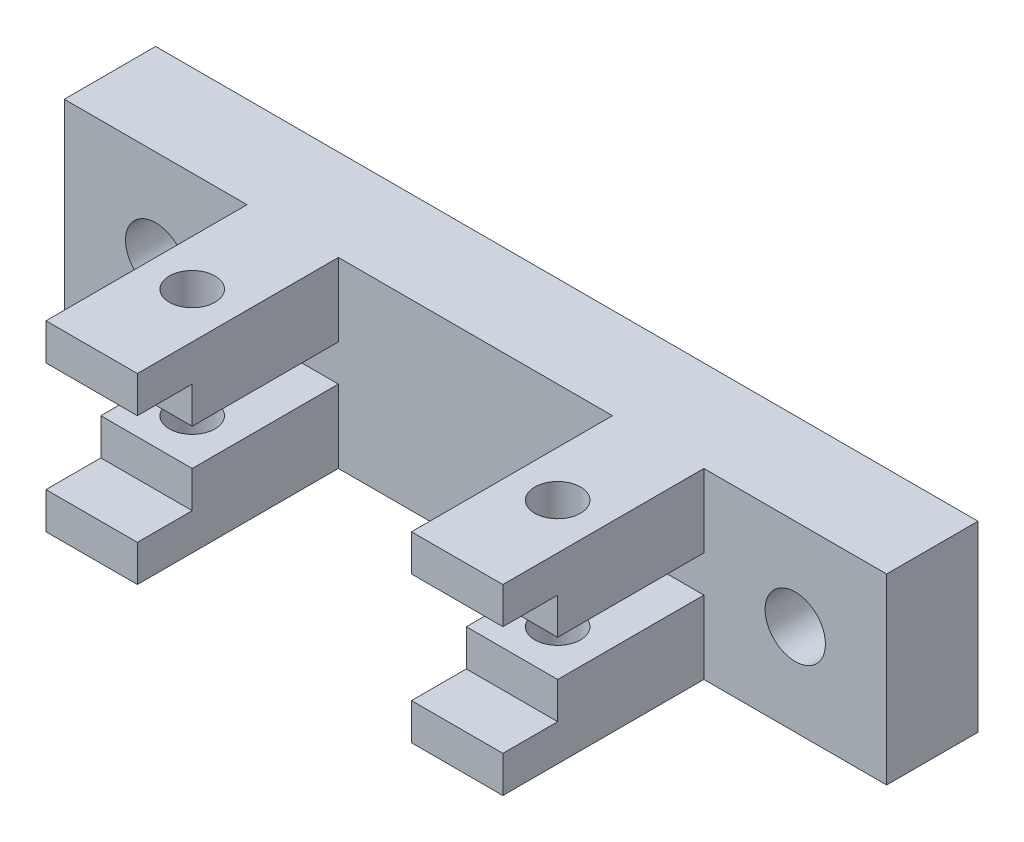
ISO-10303-21;
HEADER;
FILE_DESCRIPTION(('STEP AP214'),'2;1');
FILE_NAME('part.step','',(''),(''),'','','');
FILE_SCHEMA(('AUTOMOTIVE_DESIGN { 1 0 10303 214 1 1 1 1 }'));
ENDSEC;
DATA;
#1=APPLICATION_CONTEXT('core data for automotive mechanical design processes');
#2=APPLICATION_PROTOCOL_DEFINITION('international standard','automotive_design',2000,#1);
#3=PRODUCT_CONTEXT('',#1,'mechanical');
#4=PRODUCT('Part','Part','',(#3));
#5=PRODUCT_RELATED_PRODUCT_CATEGORY('part','',(#4));
#6=PRODUCT_DEFINITION_FORMATION('','',#4);
#7=PRODUCT_DEFINITION_CONTEXT('part definition',#1,'design');
#8=PRODUCT_DEFINITION('design','',#6,#7);
#9=PRODUCT_DEFINITION_SHAPE('','',#8);
#10=(LENGTH_UNIT() NAMED_UNIT(*) SI_UNIT(.MILLI.,.METRE.));
#11=(NAMED_UNIT(*) PLANE_ANGLE_UNIT() SI_UNIT($,.RADIAN.));
#12=(NAMED_UNIT(*) SI_UNIT($,.STERADIAN.) SOLID_ANGLE_UNIT());
#13=UNCERTAINTY_MEASURE_WITH_UNIT(LENGTH_MEASURE(1.E-05),#10,'distance_accuracy_value','');
#14=(GEOMETRIC_REPRESENTATION_CONTEXT(3) GLOBAL_UNCERTAINTY_ASSIGNED_CONTEXT((#13)) GLOBAL_UNIT_ASSIGNED_CONTEXT((#10,
#11,#12)) REPRESENTATION_CONTEXT('',''));
#15=CARTESIAN_POINT('',(0.,0.,0.));
#16=DIRECTION('',(0.,0.,1.));
#17=DIRECTION('',(1.,0.,0.));
#18=AXIS2_PLACEMENT_3D('',#15,#16,#17);
#19=CARTESIAN_POINT('',(7.5,-1.,16.));
#20=DIRECTION('',(0.,-1.,0.));
#21=DIRECTION('',(0.,0.,-1.));
#22=AXIS2_PLACEMENT_3D('',#19,#20,#21);
#23=PLANE('',#22);
#24=CARTESIAN_POINT('',(10.,-1.,10.5));
#25=DIRECTION('',(0.,-1.,0.));
#26=DIRECTION('',(0.,0.,-1.));
#27=AXIS2_PLACEMENT_3D('',#24,#25,#26);
#28=CIRCLE('',#27,1.25);
#29=CARTESIAN_POINT('',(10.,-1.,9.25));
#30=VERTEX_POINT('',#29);
#31=EDGE_CURVE('E509',#30,#30,#28,.T.);
#32=ORIENTED_EDGE('',*,*,#31,.T.);
#33=EDGE_LOOP('',(#32));
#34=FACE_BOUND('',#33,.T.);
#35=DIRECTION('',(-1.,0.,0.));
#36=VECTOR('',#35,1.);
#37=CARTESIAN_POINT('',(7.5,-1.,13.));
#38=LINE('',#37,#36);
#39=CARTESIAN_POINT('',(12.5,-1.,13.));
#40=VERTEX_POINT('',#39);
#41=CARTESIAN_POINT('',(7.5,-1.,13.));
#42=VERTEX_POINT('',#41);
#43=EDGE_CURVE('E231',#40,#42,#38,.T.);
#44=ORIENTED_EDGE('',*,*,#43,.F.);
#45=DIRECTION('',(0.,0.,-1.));
#46=VECTOR('',#45,1.);
#47=CARTESIAN_POINT('',(12.5,-1.,16.));
#48=LINE('',#47,#46);
#49=CARTESIAN_POINT('',(12.5,-1.,5.));
#50=VERTEX_POINT('',#49);
#51=EDGE_CURVE('E278',#40,#50,#48,.T.);
#52=ORIENTED_EDGE('',*,*,#51,.T.);
#53=DIRECTION('',(-1.,0.,0.));
#54=VECTOR('',#53,1.);
#55=CARTESIAN_POINT('',(7.5,-1.,5.));
#56=LINE('',#55,#54);
#57=CARTESIAN_POINT('',(7.5,-1.,5.));
#58=VERTEX_POINT('',#57);
#59=EDGE_CURVE('E264',#50,#58,#56,.T.);
#60=ORIENTED_EDGE('',*,*,#59,.T.);
#61=DIRECTION('',(0.,0.,-1.));
#62=VECTOR('',#61,1.);
#63=CARTESIAN_POINT('',(7.5,-1.,16.));
#64=LINE('',#63,#62);
#65=EDGE_CURVE('E269',#42,#58,#64,.T.);
#66=ORIENTED_EDGE('',*,*,#65,.F.);
#67=EDGE_LOOP('',(#44,#52,#60,#66));
#68=FACE_BOUND('',#67,.T.);
#69=ADVANCED_FACE('F32',(#34,#68),#23,.F.);
#70=CARTESIAN_POINT('',(-12.5,-1.,16.));
#71=DIRECTION('',(0.,-1.,0.));
#72=DIRECTION('',(0.,0.,-1.));
#73=AXIS2_PLACEMENT_3D('',#70,#71,#72);
#74=PLANE('',#73);
#75=CARTESIAN_POINT('',(-9.99999999999999,-1.,10.5));
#76=DIRECTION('',(0.,-1.,0.));
#77=DIRECTION('',(0.,0.,-1.));
#78=AXIS2_PLACEMENT_3D('',#75,#76,#77);
#79=CIRCLE('',#78,1.25);
#80=CARTESIAN_POINT('',(-9.99999999999999,-1.,9.25));
#81=VERTEX_POINT('',#80);
#82=EDGE_CURVE('E501',#81,#81,#79,.T.);
#83=ORIENTED_EDGE('',*,*,#82,.T.);
#84=EDGE_LOOP('',(#83));
#85=FACE_BOUND('',#84,.T.);
#86=DIRECTION('',(-1.,0.,0.));
#87=VECTOR('',#86,1.);
#88=CARTESIAN_POINT('',(-12.5,-1.,13.));
#89=LINE('',#88,#87);
#90=CARTESIAN_POINT('',(-7.5,-1.,13.));
#91=VERTEX_POINT('',#90);
#92=CARTESIAN_POINT('',(-12.5,-1.,13.));
#93=VERTEX_POINT('',#92);
#94=EDGE_CURVE('E254',#91,#93,#89,.T.);
#95=ORIENTED_EDGE('',*,*,#94,.F.);
#96=DIRECTION('',(0.,0.,-1.));
#97=VECTOR('',#96,1.);
#98=CARTESIAN_POINT('',(-7.5,-1.,16.));
#99=LINE('',#98,#97);
#100=CARTESIAN_POINT('',(-7.5,-1.,5.));
#101=VERTEX_POINT('',#100);
#102=EDGE_CURVE('E304',#91,#101,#99,.T.);
#103=ORIENTED_EDGE('',*,*,#102,.T.);
#104=DIRECTION('',(-1.,0.,0.));
#105=VECTOR('',#104,1.);
#106=CARTESIAN_POINT('',(-12.5,-1.,5.));
#107=LINE('',#106,#105);
#108=CARTESIAN_POINT('',(-12.5,-1.,5.));
#109=VERTEX_POINT('',#108);
#110=EDGE_CURVE('E290',#101,#109,#107,.T.);
#111=ORIENTED_EDGE('',*,*,#110,.T.);
#112=DIRECTION('',(0.,0.,-1.));
#113=VECTOR('',#112,1.);
#114=CARTESIAN_POINT('',(-12.5,-1.,16.));
#115=LINE('',#114,#113);
#116=EDGE_CURVE('E295',#93,#109,#115,.T.);
#117=ORIENTED_EDGE('',*,*,#116,.F.);
#118=EDGE_LOOP('',(#95,#103,#111,#117));
#119=FACE_BOUND('',#118,.T.);
#120=ADVANCED_FACE('F530',(#85,#119),#74,.F.);
#121=CARTESIAN_POINT('',(0.,0.,5.));
#122=DIRECTION('',(0.,0.,1.));
#123=DIRECTION('',(1.,0.,0.));
#124=AXIS2_PLACEMENT_3D('',#121,#122,#123);
#125=PLANE('',#124);
#126=CARTESIAN_POINT('',(17.5,0.,5.));
#127=DIRECTION('',(0.,0.,1.));
#128=DIRECTION('',(1.,0.,0.));
#129=AXIS2_PLACEMENT_3D('',#126,#127,#128);
#130=CIRCLE('',#129,1.65);
#131=CARTESIAN_POINT('',(19.15,0.,5.));
#132=VERTEX_POINT('',#131);
#133=EDGE_CURVE('E312',#132,#132,#130,.T.);
#134=ORIENTED_EDGE('',*,*,#133,.F.);
#135=EDGE_LOOP('',(#134));
#136=FACE_BOUND('',#135,.T.);
#137=CARTESIAN_POINT('',(-17.5,0.,5.));
#138=DIRECTION('',(0.,0.,1.));
#139=DIRECTION('',(1.,0.,0.));
#140=AXIS2_PLACEMENT_3D('',#137,#138,#139);
#141=CIRCLE('',#140,1.65);
#142=CARTESIAN_POINT('',(-15.85,0.,5.));
#143=VERTEX_POINT('',#142);
#144=EDGE_CURVE('E316',#143,#143,#141,.T.);
#145=ORIENTED_EDGE('',*,*,#144,.F.);
#146=EDGE_LOOP('',(#145));
#147=FACE_BOUND('',#146,.T.);
#148=DIRECTION('',(1.,0.,0.));
#149=VECTOR('',#148,1.);
#150=CARTESIAN_POINT('',(-22.5,-5.,5.));
#151=LINE('',#150,#149);
#152=CARTESIAN_POINT('',(-7.5,-5.,5.));
#153=VERTEX_POINT('',#152);
#154=CARTESIAN_POINT('',(7.5,-5.,5.));
#155=VERTEX_POINT('',#154);
#156=EDGE_CURVE('E448',#153,#155,#151,.T.);
#157=ORIENTED_EDGE('',*,*,#156,.T.);
#158=DIRECTION('',(0.,-1.,0.));
#159=VECTOR('',#158,1.);
#160=CARTESIAN_POINT('',(7.5,-5.,5.));
#161=LINE('',#160,#159);
#162=EDGE_CURVE('E260',#58,#155,#161,.T.);
#163=ORIENTED_EDGE('',*,*,#162,.F.);
#164=ORIENTED_EDGE('',*,*,#59,.F.);
#165=DIRECTION('',(0.,1.,0.));
#166=VECTOR('',#165,1.);
#167=CARTESIAN_POINT('',(12.5,-5.,5.));
#168=LINE('',#167,#166);
#169=CARTESIAN_POINT('',(12.5,-5.,5.));
#170=VERTEX_POINT('',#169);
#171=EDGE_CURVE('E272',#170,#50,#168,.T.);
#172=ORIENTED_EDGE('',*,*,#171,.F.);
#173=CARTESIAN_POINT('',(22.5,-5.,5.));
#174=VERTEX_POINT('',#173);
#175=EDGE_CURVE('E444',#170,#174,#151,.T.);
#176=ORIENTED_EDGE('',*,*,#175,.T.);
#177=DIRECTION('',(0.,1.,0.));
#178=VECTOR('',#177,1.);
#179=CARTESIAN_POINT('',(22.5,5.,5.));
#180=LINE('',#179,#178);
#181=CARTESIAN_POINT('',(22.5,5.,5.));
#182=VERTEX_POINT('',#181);
#183=EDGE_CURVE('E435',#174,#182,#180,.T.);
#184=ORIENTED_EDGE('',*,*,#183,.T.);
#185=DIRECTION('',(-1.,0.,0.));
#186=VECTOR('',#185,1.);
#187=CARTESIAN_POINT('',(-22.5,5.,5.));
#188=LINE('',#187,#186);
#189=CARTESIAN_POINT('',(12.5,5.,5.));
#190=VERTEX_POINT('',#189);
#191=EDGE_CURVE('E436',#182,#190,#188,.T.);
#192=ORIENTED_EDGE('',*,*,#191,.T.);
#193=DIRECTION('',(0.,1.,0.));
#194=VECTOR('',#193,1.);
#195=CARTESIAN_POINT('',(12.5,5.,5.));
#196=LINE('',#195,#194);
#197=CARTESIAN_POINT('',(12.5,0.999999999999999,5.));
#198=VERTEX_POINT('',#197);
#199=EDGE_CURVE('E373',#198,#190,#196,.T.);
#200=ORIENTED_EDGE('',*,*,#199,.F.);
#201=DIRECTION('',(1.,0.,0.));
#202=VECTOR('',#201,1.);
#203=CARTESIAN_POINT('',(7.5,0.999999999999999,5.));
#204=LINE('',#203,#202);
#205=CARTESIAN_POINT('',(7.5,0.999999999999999,5.));
#206=VERTEX_POINT('',#205);
#207=EDGE_CURVE('E380',#206,#198,#204,.T.);
#208=ORIENTED_EDGE('',*,*,#207,.F.);
#209=DIRECTION('',(0.,-1.,0.));
#210=VECTOR('',#209,1.);
#211=CARTESIAN_POINT('',(7.5,5.,5.));
#212=LINE('',#211,#210);
#213=CARTESIAN_POINT('',(7.5,5.,5.));
#214=VERTEX_POINT('',#213);
#215=EDGE_CURVE('E367',#214,#206,#212,.T.);
#216=ORIENTED_EDGE('',*,*,#215,.F.);
#217=CARTESIAN_POINT('',(-7.5,5.,5.));
#218=VERTEX_POINT('',#217);
#219=EDGE_CURVE('E36',#214,#218,#188,.T.);
#220=ORIENTED_EDGE('',*,*,#219,.T.);
#221=DIRECTION('',(0.,1.,0.));
#222=VECTOR('',#221,1.);
#223=CARTESIAN_POINT('',(-7.49999999999999,5.,5.));
#224=LINE('',#223,#222);
#225=CARTESIAN_POINT('',(-7.49999999999999,0.999999999999999,5.));
#226=VERTEX_POINT('',#225);
#227=EDGE_CURVE('E399',#226,#218,#224,.T.);
#228=ORIENTED_EDGE('',*,*,#227,.F.);
#229=DIRECTION('',(1.,0.,0.));
#230=VECTOR('',#229,1.);
#231=CARTESIAN_POINT('',(-12.5,0.999999999999999,5.));
#232=LINE('',#231,#230);
#233=CARTESIAN_POINT('',(-12.5,0.999999999999999,5.));
#234=VERTEX_POINT('',#233);
#235=EDGE_CURVE('E404',#234,#226,#232,.T.);
#236=ORIENTED_EDGE('',*,*,#235,.F.);
#237=DIRECTION('',(0.,-1.,0.));
#238=VECTOR('',#237,1.);
#239=CARTESIAN_POINT('',(-12.5,5.,5.));
#240=LINE('',#239,#238);
#241=CARTESIAN_POINT('',(-12.5,5.,5.));
#242=VERTEX_POINT('',#241);
#243=EDGE_CURVE('E394',#242,#234,#240,.T.);
#244=ORIENTED_EDGE('',*,*,#243,.F.);
#245=CARTESIAN_POINT('',(-22.5,5.,5.));
#246=VERTEX_POINT('',#245);
#247=EDGE_CURVE('E433',#242,#246,#188,.T.);
#248=ORIENTED_EDGE('',*,*,#247,.T.);
#249=DIRECTION('',(0.,-1.,0.));
#250=VECTOR('',#249,1.);
#251=CARTESIAN_POINT('',(-22.5,5.,5.));
#252=LINE('',#251,#250);
#253=CARTESIAN_POINT('',(-22.5,-5.,5.));
#254=VERTEX_POINT('',#253);
#255=EDGE_CURVE('E440',#246,#254,#252,.T.);
#256=ORIENTED_EDGE('',*,*,#255,.T.);
#257=CARTESIAN_POINT('',(-12.5,-5.,5.));
#258=VERTEX_POINT('',#257);
#259=EDGE_CURVE('E445',#254,#258,#151,.T.);
#260=ORIENTED_EDGE('',*,*,#259,.T.);
#261=DIRECTION('',(0.,-1.,0.));
#262=VECTOR('',#261,1.);
#263=CARTESIAN_POINT('',(-12.5,-5.,5.));
#264=LINE('',#263,#262);
#265=EDGE_CURVE('E286',#109,#258,#264,.T.);
#266=ORIENTED_EDGE('',*,*,#265,.F.);
#267=ORIENTED_EDGE('',*,*,#110,.F.);
#268=DIRECTION('',(0.,1.,0.));
#269=VECTOR('',#268,1.);
#270=CARTESIAN_POINT('',(-7.5,-5.,5.));
#271=LINE('',#270,#269);
#272=EDGE_CURVE('E298',#153,#101,#271,.T.);
#273=ORIENTED_EDGE('',*,*,#272,.F.);
#274=EDGE_LOOP('',(#157,#163,#164,#172,#176,#184,#192,#200,#208,#216,#220,#228,#236,#244,#248,
#256,#260,#266,#267,#273));
#275=FACE_BOUND('',#274,.T.);
#276=ADVANCED_FACE('F484',(#136,#147,#275),#125,.T.);
#277=CARTESIAN_POINT('',(7.5,0.999999999999999,16.));
#278=DIRECTION('',(0.,1.,0.));
#279=DIRECTION('',(-1.,0.,0.));
#280=AXIS2_PLACEMENT_3D('',#277,#278,#279);
#281=PLANE('',#280);
#282=CARTESIAN_POINT('',(10.,0.999999999999999,10.5));
#283=DIRECTION('',(0.,1.,0.));
#284=DIRECTION('',(-1.,0.,0.));
#285=AXIS2_PLACEMENT_3D('',#282,#283,#284);
#286=CIRCLE('',#285,1.25);
#287=CARTESIAN_POINT('',(8.75000000000001,0.999999999999999,10.5));
#288=VERTEX_POINT('',#287);
#289=EDGE_CURVE('E327',#288,#288,#286,.T.);
#290=ORIENTED_EDGE('',*,*,#289,.T.);
#291=EDGE_LOOP('',(#290));
#292=FACE_BOUND('',#291,.T.);
#293=DIRECTION('',(1.,0.,0.));
#294=VECTOR('',#293,1.);
#295=CARTESIAN_POINT('',(7.5,0.999999999999999,13.));
#296=LINE('',#295,#294);
#297=CARTESIAN_POINT('',(7.5,0.999999999999999,13.));
#298=VERTEX_POINT('',#297);
#299=CARTESIAN_POINT('',(12.5,0.999999999999999,13.));
#300=VERTEX_POINT('',#299);
#301=EDGE_CURVE('E339',#298,#300,#296,.T.);
#302=ORIENTED_EDGE('',*,*,#301,.F.);
#303=DIRECTION('',(0.,0.,-1.));
#304=VECTOR('',#303,1.);
#305=CARTESIAN_POINT('',(7.5,0.999999999999999,16.));
#306=LINE('',#305,#304);
#307=EDGE_CURVE('E392',#298,#206,#306,.T.);
#308=ORIENTED_EDGE('',*,*,#307,.T.);
#309=ORIENTED_EDGE('',*,*,#207,.T.);
#310=DIRECTION('',(0.,0.,-1.));
#311=VECTOR('',#310,1.);
#312=CARTESIAN_POINT('',(12.5,0.999999999999999,16.));
#313=LINE('',#312,#311);
#314=EDGE_CURVE('E390',#300,#198,#313,.T.);
#315=ORIENTED_EDGE('',*,*,#314,.F.);
#316=EDGE_LOOP('',(#302,#308,#309,#315));
#317=FACE_BOUND('',#316,.T.);
#318=ADVANCED_FACE('F645',(#292,#317),#281,.F.);
#319=CARTESIAN_POINT('',(-12.5,0.999999999999999,16.));
#320=DIRECTION('',(0.,1.,0.));
#321=DIRECTION('',(0.,0.,1.));
#322=AXIS2_PLACEMENT_3D('',#319,#320,#321);
#323=PLANE('',#322);
#324=CARTESIAN_POINT('',(-9.99999999999999,0.999999999999999,10.5));
#325=DIRECTION('',(0.,1.,0.));
#326=DIRECTION('',(0.,0.,1.));
#327=AXIS2_PLACEMENT_3D('',#324,#325,#326);
#328=CIRCLE('',#327,1.25);
#329=CARTESIAN_POINT('',(-9.99999999999999,0.999999999999999,11.75));
#330=VERTEX_POINT('',#329);
#331=EDGE_CURVE('E333',#330,#330,#328,.T.);
#332=ORIENTED_EDGE('',*,*,#331,.T.);
#333=EDGE_LOOP('',(#332));
#334=FACE_BOUND('',#333,.T.);
#335=DIRECTION('',(1.,0.,0.));
#336=VECTOR('',#335,1.);
#337=CARTESIAN_POINT('',(-12.5,0.999999999999999,13.));
#338=LINE('',#337,#336);
#339=CARTESIAN_POINT('',(-12.5,0.999999999999999,13.));
#340=VERTEX_POINT('',#339);
#341=CARTESIAN_POINT('',(-7.49999999999999,0.999999999999999,13.));
#342=VERTEX_POINT('',#341);
#343=EDGE_CURVE('E355',#340,#342,#338,.T.);
#344=ORIENTED_EDGE('',*,*,#343,.F.);
#345=DIRECTION('',(0.,0.,-1.));
#346=VECTOR('',#345,1.);
#347=CARTESIAN_POINT('',(-12.5,0.999999999999999,16.));
#348=LINE('',#347,#346);
#349=EDGE_CURVE('E423',#340,#234,#348,.T.);
#350=ORIENTED_EDGE('',*,*,#349,.T.);
#351=ORIENTED_EDGE('',*,*,#235,.T.);
#352=DIRECTION('',(0.,0.,-1.));
#353=VECTOR('',#352,1.);
#354=CARTESIAN_POINT('',(-7.49999999999999,0.999999999999999,16.));
#355=LINE('',#354,#353);
#356=EDGE_CURVE('E409',#342,#226,#355,.T.);
#357=ORIENTED_EDGE('',*,*,#356,.F.);
#358=EDGE_LOOP('',(#344,#350,#351,#357));
#359=FACE_BOUND('',#358,.T.);
#360=ADVANCED_FACE('F567',(#334,#359),#323,.F.);
#361=CARTESIAN_POINT('',(22.5,5.,5.));
#362=DIRECTION('',(-1.,0.,0.));
#363=DIRECTION('',(0.,0.,1.));
#364=AXIS2_PLACEMENT_3D('',#361,#362,#363);
#365=PLANE('',#364);
#366=DIRECTION('',(0.,1.,0.));
#367=VECTOR('',#366,1.);
#368=CARTESIAN_POINT('',(22.5,5.,0.));
#369=LINE('',#368,#367);
#370=CARTESIAN_POINT('',(22.5,-5.,0.));
#371=VERTEX_POINT('',#370);
#372=CARTESIAN_POINT('',(22.5,5.,0.));
#373=VERTEX_POINT('',#372);
#374=EDGE_CURVE('E449',#371,#373,#369,.T.);
#375=ORIENTED_EDGE('',*,*,#374,.T.);
#376=DIRECTION('',(0.,0.,-1.));
#377=VECTOR('',#376,1.);
#378=CARTESIAN_POINT('',(22.5,5.,5.));
#379=LINE('',#378,#377);
#380=EDGE_CURVE('E11',#182,#373,#379,.T.);
#381=ORIENTED_EDGE('',*,*,#380,.F.);
#382=ORIENTED_EDGE('',*,*,#183,.F.);
#383=DIRECTION('',(0.,0.,-1.));
#384=VECTOR('',#383,1.);
#385=CARTESIAN_POINT('',(22.5,-5.,5.));
#386=LINE('',#385,#384);
#387=EDGE_CURVE('E447',#174,#371,#386,.T.);
#388=ORIENTED_EDGE('',*,*,#387,.T.);
#389=EDGE_LOOP('',(#375,#381,#382,#388));
#390=FACE_BOUND('',#389,.T.);
#391=ADVANCED_FACE('F34',(#390),#365,.F.);
#392=CARTESIAN_POINT('',(-22.5,5.,5.));
#393=DIRECTION('',(0.,-1.,0.));
#394=DIRECTION('',(0.,0.,-1.));
#395=AXIS2_PLACEMENT_3D('',#392,#393,#394);
#396=PLANE('',#395);
#397=CARTESIAN_POINT('',(10.,5.,10.5));
#398=DIRECTION('',(0.,1.,0.));
#399=DIRECTION('',(0.,0.,1.));
#400=AXIS2_PLACEMENT_3D('',#397,#398,#399);
#401=CIRCLE('',#400,1.25);
#402=CARTESIAN_POINT('',(10.,5.,11.75));
#403=VERTEX_POINT('',#402);
#404=EDGE_CURVE('E322',#403,#403,#401,.T.);
#405=ORIENTED_EDGE('',*,*,#404,.F.);
#406=EDGE_LOOP('',(#405));
#407=FACE_BOUND('',#406,.T.);
#408=CARTESIAN_POINT('',(-9.99999999999999,5.,10.5));
#409=DIRECTION('',(0.,1.,0.));
#410=DIRECTION('',(0.,0.,1.));
#411=AXIS2_PLACEMENT_3D('',#408,#409,#410);
#412=CIRCLE('',#411,1.25);
#413=CARTESIAN_POINT('',(-9.99999999999999,5.,11.75));
#414=VERTEX_POINT('',#413);
#415=EDGE_CURVE('E330',#414,#414,#412,.T.);
#416=ORIENTED_EDGE('',*,*,#415,.F.);
#417=EDGE_LOOP('',(#416));
#418=FACE_BOUND('',#417,.T.);
#419=DIRECTION('',(-1.,0.,0.));
#420=VECTOR('',#419,1.);
#421=CARTESIAN_POINT('',(-22.5,5.,0.));
#422=LINE('',#421,#420);
#423=CARTESIAN_POINT('',(-22.5,5.,0.));
#424=VERTEX_POINT('',#423);
#425=EDGE_CURVE('E452',#373,#424,#422,.T.);
#426=ORIENTED_EDGE('',*,*,#425,.T.);
#427=DIRECTION('',(0.,0.,-1.));
#428=VECTOR('',#427,1.);
#429=CARTESIAN_POINT('',(-22.5,5.,5.));
#430=LINE('',#429,#428);
#431=EDGE_CURVE('E42',#246,#424,#430,.T.);
#432=ORIENTED_EDGE('',*,*,#431,.F.);
#433=ORIENTED_EDGE('',*,*,#247,.F.);
#434=DIRECTION('',(0.,0.,-1.));
#435=VECTOR('',#434,1.);
#436=CARTESIAN_POINT('',(-12.5,5.,16.));
#437=LINE('',#436,#435);
#438=CARTESIAN_POINT('',(-12.5,5.,16.));
#439=VERTEX_POINT('',#438);
#440=EDGE_CURVE('E403',#439,#242,#437,.T.);
#441=ORIENTED_EDGE('',*,*,#440,.F.);
#442=DIRECTION('',(-1.,0.,0.));
#443=VECTOR('',#442,1.);
#444=CARTESIAN_POINT('',(-12.5,5.,16.));
#445=LINE('',#444,#443);
#446=CARTESIAN_POINT('',(-7.49999999999999,5.,16.));
#447=VERTEX_POINT('',#446);
#448=EDGE_CURVE('E401',#447,#439,#445,.T.);
#449=ORIENTED_EDGE('',*,*,#448,.F.);
#450=DIRECTION('',(0.,0.,-1.));
#451=VECTOR('',#450,1.);
#452=CARTESIAN_POINT('',(-7.49999999999999,5.,16.));
#453=LINE('',#452,#451);
#454=EDGE_CURVE('E417',#447,#218,#453,.T.);
#455=ORIENTED_EDGE('',*,*,#454,.T.);
#456=ORIENTED_EDGE('',*,*,#219,.F.);
#457=DIRECTION('',(0.,0.,-1.));
#458=VECTOR('',#457,1.);
#459=CARTESIAN_POINT('',(7.5,5.,16.));
#460=LINE('',#459,#458);
#461=CARTESIAN_POINT('',(7.5,5.,16.));
#462=VERTEX_POINT('',#461);
#463=EDGE_CURVE('E377',#462,#214,#460,.T.);
#464=ORIENTED_EDGE('',*,*,#463,.F.);
#465=DIRECTION('',(-1.,0.,0.));
#466=VECTOR('',#465,1.);
#467=CARTESIAN_POINT('',(7.5,5.,16.));
#468=LINE('',#467,#466);
#469=CARTESIAN_POINT('',(12.5,5.,16.));
#470=VERTEX_POINT('',#469);
#471=EDGE_CURVE('E375',#470,#462,#468,.T.);
#472=ORIENTED_EDGE('',*,*,#471,.F.);
#473=DIRECTION('',(0.,0.,-1.));
#474=VECTOR('',#473,1.);
#475=CARTESIAN_POINT('',(12.5,5.,16.));
#476=LINE('',#475,#474);
#477=EDGE_CURVE('E387',#470,#190,#476,.T.);
#478=ORIENTED_EDGE('',*,*,#477,.T.);
#479=ORIENTED_EDGE('',*,*,#191,.F.);
#480=ORIENTED_EDGE('',*,*,#380,.T.);
#481=EDGE_LOOP('',(#426,#432,#433,#441,#449,#455,#456,#464,#472,#478,#479,#480));
#482=FACE_BOUND('',#481,.T.);
#483=ADVANCED_FACE('F551',(#407,#418,#482),#396,.F.);
#484=CARTESIAN_POINT('',(-22.5,5.,5.));
#485=DIRECTION('',(1.,0.,0.));
#486=DIRECTION('',(0.,0.,-1.));
#487=AXIS2_PLACEMENT_3D('',#484,#485,#486);
#488=PLANE('',#487);
#489=DIRECTION('',(0.,-1.,0.));
#490=VECTOR('',#489,1.);
#491=CARTESIAN_POINT('',(-22.5,5.,0.));
#492=LINE('',#491,#490);
#493=CARTESIAN_POINT('',(-22.5,-5.,0.));
#494=VERTEX_POINT('',#493);
#495=EDGE_CURVE('E454',#424,#494,#492,.T.);
#496=ORIENTED_EDGE('',*,*,#495,.T.);
#497=DIRECTION('',(0.,0.,-1.));
#498=VECTOR('',#497,1.);
#499=CARTESIAN_POINT('',(-22.5,-5.,5.));
#500=LINE('',#499,#498);
#501=EDGE_CURVE('E460',#254,#494,#500,.T.);
#502=ORIENTED_EDGE('',*,*,#501,.F.);
#503=ORIENTED_EDGE('',*,*,#255,.F.);
#504=ORIENTED_EDGE('',*,*,#431,.T.);
#505=EDGE_LOOP('',(#496,#502,#503,#504));
#506=FACE_BOUND('',#505,.T.);
#507=ADVANCED_FACE('F468',(#506),#488,.F.);
#508=CARTESIAN_POINT('',(-22.5,-5.,5.));
#509=DIRECTION('',(0.,1.,0.));
#510=DIRECTION('',(0.,0.,1.));
#511=AXIS2_PLACEMENT_3D('',#508,#509,#510);
#512=PLANE('',#511);
#513=CARTESIAN_POINT('',(10.,-5.,10.5));
#514=DIRECTION('',(0.,-1.,0.));
#515=DIRECTION('',(0.,0.,-1.));
#516=AXIS2_PLACEMENT_3D('',#513,#514,#515);
#517=CIRCLE('',#516,1.25);
#518=CARTESIAN_POINT('',(10.,-5.,9.25));
#519=VERTEX_POINT('',#518);
#520=EDGE_CURVE('E512',#519,#519,#517,.T.);
#521=ORIENTED_EDGE('',*,*,#520,.F.);
#522=EDGE_LOOP('',(#521));
#523=FACE_BOUND('',#522,.T.);
#524=CARTESIAN_POINT('',(-9.99999999999999,-5.,10.5));
#525=DIRECTION('',(0.,-1.,0.));
#526=DIRECTION('',(0.,0.,-1.));
#527=AXIS2_PLACEMENT_3D('',#524,#525,#526);
#528=CIRCLE('',#527,1.25);
#529=CARTESIAN_POINT('',(-9.99999999999999,-5.,9.25));
#530=VERTEX_POINT('',#529);
#531=EDGE_CURVE('E503',#530,#530,#528,.T.);
#532=ORIENTED_EDGE('',*,*,#531,.F.);
#533=EDGE_LOOP('',(#532));
#534=FACE_BOUND('',#533,.T.);
#535=DIRECTION('',(1.,0.,0.));
#536=VECTOR('',#535,1.);
#537=CARTESIAN_POINT('',(-22.5,-5.,0.));
#538=LINE('',#537,#536);
#539=EDGE_CURVE('E456',#494,#371,#538,.T.);
#540=ORIENTED_EDGE('',*,*,#539,.T.);
#541=ORIENTED_EDGE('',*,*,#387,.F.);
#542=ORIENTED_EDGE('',*,*,#175,.F.);
#543=DIRECTION('',(0.,0.,-1.));
#544=VECTOR('',#543,1.);
#545=CARTESIAN_POINT('',(12.5,-5.,16.));
#546=LINE('',#545,#544);
#547=CARTESIAN_POINT('',(12.5,-5.,16.));
#548=VERTEX_POINT('',#547);
#549=EDGE_CURVE('E280',#548,#170,#546,.T.);
#550=ORIENTED_EDGE('',*,*,#549,.F.);
#551=DIRECTION('',(1.,0.,0.));
#552=VECTOR('',#551,1.);
#553=CARTESIAN_POINT('',(7.5,-5.,16.));
#554=LINE('',#553,#552);
#555=CARTESIAN_POINT('',(7.5,-5.,16.));
#556=VERTEX_POINT('',#555);
#557=EDGE_CURVE('E263',#556,#548,#554,.T.);
#558=ORIENTED_EDGE('',*,*,#557,.F.);
#559=DIRECTION('',(0.,0.,-1.));
#560=VECTOR('',#559,1.);
#561=CARTESIAN_POINT('',(7.5,-5.,16.));
#562=LINE('',#561,#560);
#563=EDGE_CURVE('E283',#556,#155,#562,.T.);
#564=ORIENTED_EDGE('',*,*,#563,.T.);
#565=ORIENTED_EDGE('',*,*,#156,.F.);
#566=DIRECTION('',(0.,0.,-1.));
#567=VECTOR('',#566,1.);
#568=CARTESIAN_POINT('',(-7.5,-5.,16.));
#569=LINE('',#568,#567);
#570=CARTESIAN_POINT('',(-7.5,-5.,16.));
#571=VERTEX_POINT('',#570);
#572=EDGE_CURVE('E306',#571,#153,#569,.T.);
#573=ORIENTED_EDGE('',*,*,#572,.F.);
#574=DIRECTION('',(1.,0.,0.));
#575=VECTOR('',#574,1.);
#576=CARTESIAN_POINT('',(-12.5,-5.,16.));
#577=LINE('',#576,#575);
#578=CARTESIAN_POINT('',(-12.5,-5.,16.));
#579=VERTEX_POINT('',#578);
#580=EDGE_CURVE('E289',#579,#571,#577,.T.);
#581=ORIENTED_EDGE('',*,*,#580,.F.);
#582=DIRECTION('',(0.,0.,-1.));
#583=VECTOR('',#582,1.);
#584=CARTESIAN_POINT('',(-12.5,-5.,16.));
#585=LINE('',#584,#583);
#586=EDGE_CURVE('E309',#579,#258,#585,.T.);
#587=ORIENTED_EDGE('',*,*,#586,.T.);
#588=ORIENTED_EDGE('',*,*,#259,.F.);
#589=ORIENTED_EDGE('',*,*,#501,.T.);
#590=EDGE_LOOP('',(#540,#541,#542,#550,#558,#564,#565,#573,#581,#587,#588,#589));
#591=FACE_BOUND('',#590,.T.);
#592=ADVANCED_FACE('F477',(#523,#534,#591),#512,.F.);
#593=CARTESIAN_POINT('',(0.,0.,0.));
#594=DIRECTION('',(0.,0.,1.));
#595=DIRECTION('',(1.,0.,0.));
#596=AXIS2_PLACEMENT_3D('',#593,#594,#595);
#597=PLANE('',#596);
#598=CARTESIAN_POINT('',(17.5,0.,0.));
#599=DIRECTION('',(0.,0.,1.));
#600=DIRECTION('',(1.,0.,0.));
#601=AXIS2_PLACEMENT_3D('',#598,#599,#600);
#602=CIRCLE('',#601,1.65);
#603=CARTESIAN_POINT('',(19.15,0.,0.));
#604=VERTEX_POINT('',#603);
#605=EDGE_CURVE('E313',#604,#604,#602,.T.);
#606=ORIENTED_EDGE('',*,*,#605,.T.);
#607=EDGE_LOOP('',(#606));
#608=FACE_BOUND('',#607,.T.);
#609=CARTESIAN_POINT('',(-17.5,0.,0.));
#610=DIRECTION('',(0.,0.,1.));
#611=DIRECTION('',(1.,0.,0.));
#612=AXIS2_PLACEMENT_3D('',#609,#610,#611);
#613=CIRCLE('',#612,1.65);
#614=CARTESIAN_POINT('',(-15.85,0.,0.));
#615=VERTEX_POINT('',#614);
#616=EDGE_CURVE('E319',#615,#615,#613,.T.);
#617=ORIENTED_EDGE('',*,*,#616,.T.);
#618=EDGE_LOOP('',(#617));
#619=FACE_BOUND('',#618,.T.);
#620=ORIENTED_EDGE('',*,*,#374,.F.);
#621=ORIENTED_EDGE('',*,*,#539,.F.);
#622=ORIENTED_EDGE('',*,*,#495,.F.);
#623=ORIENTED_EDGE('',*,*,#425,.F.);
#624=EDGE_LOOP('',(#620,#621,#622,#623));
#625=FACE_BOUND('',#624,.T.);
#626=ADVANCED_FACE('F474',(#608,#619,#625),#597,.F.);
#627=CARTESIAN_POINT('',(-12.5,5.,16.));
#628=DIRECTION('',(1.,0.,0.));
#629=DIRECTION('',(0.,0.,-1.));
#630=AXIS2_PLACEMENT_3D('',#627,#628,#629);
#631=PLANE('',#630);
#632=DIRECTION('',(0.,-1.,0.));
#633=VECTOR('',#632,1.);
#634=CARTESIAN_POINT('',(-12.5,3.,13.));
#635=LINE('',#634,#633);
#636=CARTESIAN_POINT('',(-12.5,3.,13.));
#637=VERTEX_POINT('',#636);
#638=EDGE_CURVE('E353',#637,#340,#635,.T.);
#639=ORIENTED_EDGE('',*,*,#638,.F.);
#640=DIRECTION('',(0.,0.,1.));
#641=VECTOR('',#640,1.);
#642=CARTESIAN_POINT('',(-12.5,3.,13.));
#643=LINE('',#642,#641);
#644=CARTESIAN_POINT('',(-12.5,3.,16.));
#645=VERTEX_POINT('',#644);
#646=EDGE_CURVE('E364',#637,#645,#643,.T.);
#647=ORIENTED_EDGE('',*,*,#646,.T.);
#648=DIRECTION('',(0.,-1.,0.));
#649=VECTOR('',#648,1.);
#650=CARTESIAN_POINT('',(-12.5,5.,16.));
#651=LINE('',#650,#649);
#652=EDGE_CURVE('E395',#439,#645,#651,.T.);
#653=ORIENTED_EDGE('',*,*,#652,.F.);
#654=ORIENTED_EDGE('',*,*,#440,.T.);
#655=ORIENTED_EDGE('',*,*,#243,.T.);
#656=ORIENTED_EDGE('',*,*,#349,.F.);
#657=EDGE_LOOP('',(#639,#647,#653,#654,#655,#656));
#658=FACE_BOUND('',#657,.T.);
#659=ADVANCED_FACE('F553',(#658),#631,.F.);
#660=CARTESIAN_POINT('',(-7.49999999999999,5.,16.));
#661=DIRECTION('',(-1.,0.,0.));
#662=DIRECTION('',(0.,-1.,0.));
#663=AXIS2_PLACEMENT_3D('',#660,#661,#662);
#664=PLANE('',#663);
#665=DIRECTION('',(0.,1.,0.));
#666=VECTOR('',#665,1.);
#667=CARTESIAN_POINT('',(-7.49999999999999,5.,16.));
#668=LINE('',#667,#666);
#669=CARTESIAN_POINT('',(-7.49999999999999,3.,16.));
#670=VERTEX_POINT('',#669);
#671=EDGE_CURVE('E398',#670,#447,#668,.T.);
#672=ORIENTED_EDGE('',*,*,#671,.F.);
#673=DIRECTION('',(0.,0.,1.));
#674=VECTOR('',#673,1.);
#675=CARTESIAN_POINT('',(-7.49999999999999,3.,13.));
#676=LINE('',#675,#674);
#677=CARTESIAN_POINT('',(-7.49999999999999,3.,13.));
#678=VERTEX_POINT('',#677);
#679=EDGE_CURVE('E362',#678,#670,#676,.T.);
#680=ORIENTED_EDGE('',*,*,#679,.F.);
#681=DIRECTION('',(0.,1.,0.));
#682=VECTOR('',#681,1.);
#683=CARTESIAN_POINT('',(-7.49999999999999,3.,13.));
#684=LINE('',#683,#682);
#685=EDGE_CURVE('E357',#342,#678,#684,.T.);
#686=ORIENTED_EDGE('',*,*,#685,.F.);
#687=ORIENTED_EDGE('',*,*,#356,.T.);
#688=ORIENTED_EDGE('',*,*,#227,.T.);
#689=ORIENTED_EDGE('',*,*,#454,.F.);
#690=EDGE_LOOP('',(#672,#680,#686,#687,#688,#689));
#691=FACE_BOUND('',#690,.T.);
#692=ADVANCED_FACE('F560',(#691),#664,.F.);
#693=CARTESIAN_POINT('',(0.,0.,16.));
#694=DIRECTION('',(0.,0.,1.));
#695=DIRECTION('',(1.,0.,0.));
#696=AXIS2_PLACEMENT_3D('',#693,#694,#695);
#697=PLANE('',#696);
#698=DIRECTION('',(-1.,0.,0.));
#699=VECTOR('',#698,1.);
#700=CARTESIAN_POINT('',(-12.5,3.,16.));
#701=LINE('',#700,#699);
#702=EDGE_CURVE('E351',#670,#645,#701,.T.);
#703=ORIENTED_EDGE('',*,*,#702,.F.);
#704=ORIENTED_EDGE('',*,*,#671,.T.);
#705=ORIENTED_EDGE('',*,*,#448,.T.);
#706=ORIENTED_EDGE('',*,*,#652,.T.);
#707=EDGE_LOOP('',(#703,#704,#705,#706));
#708=FACE_BOUND('',#707,.T.);
#709=ADVANCED_FACE('F556',(#708),#697,.T.);
#710=CARTESIAN_POINT('',(7.5,5.,16.));
#711=DIRECTION('',(1.,0.,0.));
#712=DIRECTION('',(0.,1.,0.));
#713=AXIS2_PLACEMENT_3D('',#710,#711,#712);
#714=PLANE('',#713);
#715=DIRECTION('',(0.,-1.,0.));
#716=VECTOR('',#715,1.);
#717=CARTESIAN_POINT('',(7.5,3.,13.));
#718=LINE('',#717,#716);
#719=CARTESIAN_POINT('',(7.5,3.,13.));
#720=VERTEX_POINT('',#719);
#721=EDGE_CURVE('E337',#720,#298,#718,.T.);
#722=ORIENTED_EDGE('',*,*,#721,.F.);
#723=DIRECTION('',(0.,0.,1.));
#724=VECTOR('',#723,1.);
#725=CARTESIAN_POINT('',(7.5,3.,13.));
#726=LINE('',#725,#724);
#727=CARTESIAN_POINT('',(7.5,3.,16.));
#728=VERTEX_POINT('',#727);
#729=EDGE_CURVE('E348',#720,#728,#726,.T.);
#730=ORIENTED_EDGE('',*,*,#729,.T.);
#731=DIRECTION('',(0.,-1.,0.));
#732=VECTOR('',#731,1.);
#733=CARTESIAN_POINT('',(7.5,5.,16.));
#734=LINE('',#733,#732);
#735=EDGE_CURVE('E369',#462,#728,#734,.T.);
#736=ORIENTED_EDGE('',*,*,#735,.F.);
#737=ORIENTED_EDGE('',*,*,#463,.T.);
#738=ORIENTED_EDGE('',*,*,#215,.T.);
#739=ORIENTED_EDGE('',*,*,#307,.F.);
#740=EDGE_LOOP('',(#722,#730,#736,#737,#738,#739));
#741=FACE_BOUND('',#740,.T.);
#742=ADVANCED_FACE('F636',(#741),#714,.F.);
#743=CARTESIAN_POINT('',(12.5,5.,16.));
#744=DIRECTION('',(-1.,0.,0.));
#745=DIRECTION('',(0.,0.,1.));
#746=AXIS2_PLACEMENT_3D('',#743,#744,#745);
#747=PLANE('',#746);
#748=DIRECTION('',(0.,1.,0.));
#749=VECTOR('',#748,1.);
#750=CARTESIAN_POINT('',(12.5,5.,16.));
#751=LINE('',#750,#749);
#752=CARTESIAN_POINT('',(12.5,3.,16.));
#753=VERTEX_POINT('',#752);
#754=EDGE_CURVE('E372',#753,#470,#751,.T.);
#755=ORIENTED_EDGE('',*,*,#754,.F.);
#756=DIRECTION('',(0.,0.,1.));
#757=VECTOR('',#756,1.);
#758=CARTESIAN_POINT('',(12.5,3.,13.));
#759=LINE('',#758,#757);
#760=CARTESIAN_POINT('',(12.5,3.,13.));
#761=VERTEX_POINT('',#760);
#762=EDGE_CURVE('E346',#761,#753,#759,.T.);
#763=ORIENTED_EDGE('',*,*,#762,.F.);
#764=DIRECTION('',(0.,1.,0.));
#765=VECTOR('',#764,1.);
#766=CARTESIAN_POINT('',(12.5,3.,13.));
#767=LINE('',#766,#765);
#768=EDGE_CURVE('E341',#300,#761,#767,.T.);
#769=ORIENTED_EDGE('',*,*,#768,.F.);
#770=ORIENTED_EDGE('',*,*,#314,.T.);
#771=ORIENTED_EDGE('',*,*,#199,.T.);
#772=ORIENTED_EDGE('',*,*,#477,.F.);
#773=EDGE_LOOP('',(#755,#763,#769,#770,#771,#772));
#774=FACE_BOUND('',#773,.T.);
#775=ADVANCED_FACE('F583',(#774),#747,.F.);
#776=CARTESIAN_POINT('',(0.,0.,16.));
#777=DIRECTION('',(0.,0.,1.));
#778=DIRECTION('',(1.,0.,0.));
#779=AXIS2_PLACEMENT_3D('',#776,#777,#778);
#780=PLANE('',#779);
#781=DIRECTION('',(-1.,0.,0.));
#782=VECTOR('',#781,1.);
#783=CARTESIAN_POINT('',(7.5,3.,16.));
#784=LINE('',#783,#782);
#785=EDGE_CURVE('E336',#753,#728,#784,.T.);
#786=ORIENTED_EDGE('',*,*,#785,.F.);
#787=ORIENTED_EDGE('',*,*,#754,.T.);
#788=ORIENTED_EDGE('',*,*,#471,.T.);
#789=ORIENTED_EDGE('',*,*,#735,.T.);
#790=EDGE_LOOP('',(#786,#787,#788,#789));
#791=FACE_BOUND('',#790,.T.);
#792=ADVANCED_FACE('F575',(#791),#780,.T.);
#793=CARTESIAN_POINT('',(-12.5,3.,13.));
#794=DIRECTION('',(0.,1.,0.));
#795=DIRECTION('',(0.,0.,1.));
#796=AXIS2_PLACEMENT_3D('',#793,#794,#795);
#797=PLANE('',#796);
#798=ORIENTED_EDGE('',*,*,#702,.T.);
#799=ORIENTED_EDGE('',*,*,#646,.F.);
#800=DIRECTION('',(-1.,0.,0.));
#801=VECTOR('',#800,1.);
#802=CARTESIAN_POINT('',(-12.5,3.,13.));
#803=LINE('',#802,#801);
#804=EDGE_CURVE('E359',#678,#637,#803,.T.);
#805=ORIENTED_EDGE('',*,*,#804,.F.);
#806=ORIENTED_EDGE('',*,*,#679,.T.);
#807=EDGE_LOOP('',(#798,#799,#805,#806));
#808=FACE_BOUND('',#807,.T.);
#809=ADVANCED_FACE('F573',(#808),#797,.F.);
#810=CARTESIAN_POINT('',(0.,0.,13.));
#811=DIRECTION('',(0.,0.,1.));
#812=DIRECTION('',(1.,0.,0.));
#813=AXIS2_PLACEMENT_3D('',#810,#811,#812);
#814=PLANE('',#813);
#815=ORIENTED_EDGE('',*,*,#638,.T.);
#816=ORIENTED_EDGE('',*,*,#343,.T.);
#817=ORIENTED_EDGE('',*,*,#685,.T.);
#818=ORIENTED_EDGE('',*,*,#804,.T.);
#819=EDGE_LOOP('',(#815,#816,#817,#818));
#820=FACE_BOUND('',#819,.T.);
#821=ADVANCED_FACE('F570',(#820),#814,.T.);
#822=CARTESIAN_POINT('',(7.5,3.,13.));
#823=DIRECTION('',(0.,1.,0.));
#824=DIRECTION('',(0.,0.,1.));
#825=AXIS2_PLACEMENT_3D('',#822,#823,#824);
#826=PLANE('',#825);
#827=ORIENTED_EDGE('',*,*,#785,.T.);
#828=ORIENTED_EDGE('',*,*,#729,.F.);
#829=DIRECTION('',(-1.,0.,0.));
#830=VECTOR('',#829,1.);
#831=CARTESIAN_POINT('',(7.5,3.,13.));
#832=LINE('',#831,#830);
#833=EDGE_CURVE('E343',#761,#720,#832,.T.);
#834=ORIENTED_EDGE('',*,*,#833,.F.);
#835=ORIENTED_EDGE('',*,*,#762,.T.);
#836=EDGE_LOOP('',(#827,#828,#834,#835));
#837=FACE_BOUND('',#836,.T.);
#838=ADVANCED_FACE('F581',(#837),#826,.F.);
#839=CARTESIAN_POINT('',(0.,0.,13.));
#840=DIRECTION('',(0.,0.,1.));
#841=DIRECTION('',(1.,0.,0.));
#842=AXIS2_PLACEMENT_3D('',#839,#840,#841);
#843=PLANE('',#842);
#844=ORIENTED_EDGE('',*,*,#721,.T.);
#845=ORIENTED_EDGE('',*,*,#301,.T.);
#846=ORIENTED_EDGE('',*,*,#768,.T.);
#847=ORIENTED_EDGE('',*,*,#833,.T.);
#848=EDGE_LOOP('',(#844,#845,#846,#847));
#849=FACE_BOUND('',#848,.T.);
#850=ADVANCED_FACE('F620',(#849),#843,.T.);
#851=CARTESIAN_POINT('',(-9.99999999999999,-5.,10.5));
#852=DIRECTION('',(0.,1.,0.));
#853=DIRECTION('',(0.,0.,1.));
#854=AXIS2_PLACEMENT_3D('',#851,#852,#853);
#855=CYLINDRICAL_SURFACE('',#854,1.25);
#856=ORIENTED_EDGE('',*,*,#415,.T.);
#857=EDGE_LOOP('',(#856));
#858=FACE_BOUND('',#857,.T.);
#859=ORIENTED_EDGE('',*,*,#331,.F.);
#860=EDGE_LOOP('',(#859));
#861=FACE_BOUND('',#860,.T.);
#862=ADVANCED_FACE('F616',(#858,#861),#855,.F.);
#863=CARTESIAN_POINT('',(10.,-5.,10.5));
#864=DIRECTION('',(0.,1.,0.));
#865=DIRECTION('',(0.,0.,1.));
#866=AXIS2_PLACEMENT_3D('',#863,#864,#865);
#867=CYLINDRICAL_SURFACE('',#866,1.25);
#868=ORIENTED_EDGE('',*,*,#404,.T.);
#869=EDGE_LOOP('',(#868));
#870=FACE_BOUND('',#869,.T.);
#871=ORIENTED_EDGE('',*,*,#289,.F.);
#872=EDGE_LOOP('',(#871));
#873=FACE_BOUND('',#872,.T.);
#874=ADVANCED_FACE('F612',(#870,#873),#867,.F.);
#875=CARTESIAN_POINT('',(-17.5,0.,0.));
#876=DIRECTION('',(0.,0.,1.));
#877=DIRECTION('',(1.,0.,0.));
#878=AXIS2_PLACEMENT_3D('',#875,#876,#877);
#879=CYLINDRICAL_SURFACE('',#878,1.65);
#880=ORIENTED_EDGE('',*,*,#616,.F.);
#881=EDGE_LOOP('',(#880));
#882=FACE_BOUND('',#881,.T.);
#883=ORIENTED_EDGE('',*,*,#144,.T.);
#884=EDGE_LOOP('',(#883));
#885=FACE_BOUND('',#884,.T.);
#886=ADVANCED_FACE('F608',(#882,#885),#879,.F.);
#887=CARTESIAN_POINT('',(17.5,0.,0.));
#888=DIRECTION('',(0.,0.,1.));
#889=DIRECTION('',(1.,0.,0.));
#890=AXIS2_PLACEMENT_3D('',#887,#888,#889);
#891=CYLINDRICAL_SURFACE('',#890,1.65);
#892=ORIENTED_EDGE('',*,*,#605,.F.);
#893=EDGE_LOOP('',(#892));
#894=FACE_BOUND('',#893,.T.);
#895=ORIENTED_EDGE('',*,*,#133,.T.);
#896=EDGE_LOOP('',(#895));
#897=FACE_BOUND('',#896,.T.);
#898=ADVANCED_FACE('F605',(#894,#897),#891,.F.);
#899=CARTESIAN_POINT('',(-12.5,-5.,16.));
#900=DIRECTION('',(1.,0.,0.));
#901=DIRECTION('',(0.,0.,-1.));
#902=AXIS2_PLACEMENT_3D('',#899,#900,#901);
#903=PLANE('',#902);
#904=DIRECTION('',(0.,-1.,0.));
#905=VECTOR('',#904,1.);
#906=CARTESIAN_POINT('',(-12.5,-5.,16.));
#907=LINE('',#906,#905);
#908=CARTESIAN_POINT('',(-12.5,-3.,16.));
#909=VERTEX_POINT('',#908);
#910=EDGE_CURVE('E287',#909,#579,#907,.T.);
#911=ORIENTED_EDGE('',*,*,#910,.F.);
#912=DIRECTION('',(0.,0.,1.));
#913=VECTOR('',#912,1.);
#914=CARTESIAN_POINT('',(-12.5,-3.,13.));
#915=LINE('',#914,#913);
#916=CARTESIAN_POINT('',(-12.5,-3.,13.));
#917=VERTEX_POINT('',#916);
#918=EDGE_CURVE('E58',#917,#909,#915,.T.);
#919=ORIENTED_EDGE('',*,*,#918,.F.);
#920=DIRECTION('',(0.,-1.,0.));
#921=VECTOR('',#920,1.);
#922=CARTESIAN_POINT('',(-12.5,-1.,13.));
#923=LINE('',#922,#921);
#924=EDGE_CURVE('E246',#93,#917,#923,.T.);
#925=ORIENTED_EDGE('',*,*,#924,.F.);
#926=ORIENTED_EDGE('',*,*,#116,.T.);
#927=ORIENTED_EDGE('',*,*,#265,.T.);
#928=ORIENTED_EDGE('',*,*,#586,.F.);
#929=EDGE_LOOP('',(#911,#919,#925,#926,#927,#928));
#930=FACE_BOUND('',#929,.T.);
#931=ADVANCED_FACE('F548',(#930),#903,.F.);
#932=CARTESIAN_POINT('',(-7.5,-5.,16.));
#933=DIRECTION('',(-1.,0.,0.));
#934=DIRECTION('',(0.,-1.,0.));
#935=AXIS2_PLACEMENT_3D('',#932,#933,#934);
#936=PLANE('',#935);
#937=DIRECTION('',(0.,1.,0.));
#938=VECTOR('',#937,1.);
#939=CARTESIAN_POINT('',(-7.5,-1.,13.));
#940=LINE('',#939,#938);
#941=CARTESIAN_POINT('',(-7.5,-3.,13.));
#942=VERTEX_POINT('',#941);
#943=EDGE_CURVE('E252',#942,#91,#940,.T.);
#944=ORIENTED_EDGE('',*,*,#943,.F.);
#945=DIRECTION('',(0.,0.,1.));
#946=VECTOR('',#945,1.);
#947=CARTESIAN_POINT('',(-7.5,-3.,13.));
#948=LINE('',#947,#946);
#949=CARTESIAN_POINT('',(-7.5,-3.,16.));
#950=VERTEX_POINT('',#949);
#951=EDGE_CURVE('E257',#942,#950,#948,.T.);
#952=ORIENTED_EDGE('',*,*,#951,.T.);
#953=DIRECTION('',(0.,1.,0.));
#954=VECTOR('',#953,1.);
#955=CARTESIAN_POINT('',(-7.5,-5.,16.));
#956=LINE('',#955,#954);
#957=EDGE_CURVE('E292',#571,#950,#956,.T.);
#958=ORIENTED_EDGE('',*,*,#957,.F.);
#959=ORIENTED_EDGE('',*,*,#572,.T.);
#960=ORIENTED_EDGE('',*,*,#272,.T.);
#961=ORIENTED_EDGE('',*,*,#102,.F.);
#962=EDGE_LOOP('',(#944,#952,#958,#959,#960,#961));
#963=FACE_BOUND('',#962,.T.);
#964=ADVANCED_FACE('F541',(#963),#936,.F.);
#965=CARTESIAN_POINT('',(0.,0.,16.));
#966=DIRECTION('',(0.,0.,-1.));
#967=DIRECTION('',(-1.,0.,0.));
#968=AXIS2_PLACEMENT_3D('',#965,#966,#967);
#969=PLANE('',#968);
#970=ORIENTED_EDGE('',*,*,#957,.T.);
#971=DIRECTION('',(1.,0.,0.));
#972=VECTOR('',#971,1.);
#973=CARTESIAN_POINT('',(-12.5,-3.,16.));
#974=LINE('',#973,#972);
#975=EDGE_CURVE('E241',#909,#950,#974,.T.);
#976=ORIENTED_EDGE('',*,*,#975,.F.);
#977=ORIENTED_EDGE('',*,*,#910,.T.);
#978=ORIENTED_EDGE('',*,*,#580,.T.);
#979=EDGE_LOOP('',(#970,#976,#977,#978));
#980=FACE_BOUND('',#979,.T.);
#981=ADVANCED_FACE('F598',(#980),#969,.F.);
#982=CARTESIAN_POINT('',(7.5,-5.,16.));
#983=DIRECTION('',(1.,0.,0.));
#984=DIRECTION('',(0.,1.,0.));
#985=AXIS2_PLACEMENT_3D('',#982,#983,#984);
#986=PLANE('',#985);
#987=DIRECTION('',(0.,-1.,0.));
#988=VECTOR('',#987,1.);
#989=CARTESIAN_POINT('',(7.5,-5.,16.));
#990=LINE('',#989,#988);
#991=CARTESIAN_POINT('',(7.5,-3.,16.));
#992=VERTEX_POINT('',#991);
#993=EDGE_CURVE('E239',#992,#556,#990,.T.);
#994=ORIENTED_EDGE('',*,*,#993,.F.);
#995=DIRECTION('',(0.,0.,1.));
#996=VECTOR('',#995,1.);
#997=CARTESIAN_POINT('',(7.5,-3.,13.));
#998=LINE('',#997,#996);
#999=CARTESIAN_POINT('',(7.5,-3.,13.));
#1000=VERTEX_POINT('',#999);
#1001=EDGE_CURVE('E50',#1000,#992,#998,.T.);
#1002=ORIENTED_EDGE('',*,*,#1001,.F.);
#1003=DIRECTION('',(0.,-1.,0.));
#1004=VECTOR('',#1003,1.);
#1005=CARTESIAN_POINT('',(7.5,-1.,13.));
#1006=LINE('',#1005,#1004);
#1007=EDGE_CURVE('E226',#42,#1000,#1006,.T.);
#1008=ORIENTED_EDGE('',*,*,#1007,.F.);
#1009=ORIENTED_EDGE('',*,*,#65,.T.);
#1010=ORIENTED_EDGE('',*,*,#162,.T.);
#1011=ORIENTED_EDGE('',*,*,#563,.F.);
#1012=EDGE_LOOP('',(#994,#1002,#1008,#1009,#1010,#1011));
#1013=FACE_BOUND('',#1012,.T.);
#1014=ADVANCED_FACE('F237',(#1013),#986,.F.);
#1015=CARTESIAN_POINT('',(12.5,-5.,16.));
#1016=DIRECTION('',(-1.,0.,0.));
#1017=DIRECTION('',(0.,-1.,0.));
#1018=AXIS2_PLACEMENT_3D('',#1015,#1016,#1017);
#1019=PLANE('',#1018);
#1020=DIRECTION('',(0.,1.,0.));
#1021=VECTOR('',#1020,1.);
#1022=CARTESIAN_POINT('',(12.5,-1.,13.));
#1023=LINE('',#1022,#1021);
#1024=CARTESIAN_POINT('',(12.5,-3.,13.));
#1025=VERTEX_POINT('',#1024);
#1026=EDGE_CURVE('E225',#1025,#40,#1023,.T.);
#1027=ORIENTED_EDGE('',*,*,#1026,.F.);
#1028=DIRECTION('',(0.,0.,1.));
#1029=VECTOR('',#1028,1.);
#1030=CARTESIAN_POINT('',(12.5,-3.,13.));
#1031=LINE('',#1030,#1029);
#1032=CARTESIAN_POINT('',(12.5,-3.,16.));
#1033=VERTEX_POINT('',#1032);
#1034=EDGE_CURVE('E222',#1025,#1033,#1031,.T.);
#1035=ORIENTED_EDGE('',*,*,#1034,.T.);
#1036=DIRECTION('',(0.,1.,0.));
#1037=VECTOR('',#1036,1.);
#1038=CARTESIAN_POINT('',(12.5,-5.,16.));
#1039=LINE('',#1038,#1037);
#1040=EDGE_CURVE('E266',#548,#1033,#1039,.T.);
#1041=ORIENTED_EDGE('',*,*,#1040,.F.);
#1042=ORIENTED_EDGE('',*,*,#549,.T.);
#1043=ORIENTED_EDGE('',*,*,#171,.T.);
#1044=ORIENTED_EDGE('',*,*,#51,.F.);
#1045=EDGE_LOOP('',(#1027,#1035,#1041,#1042,#1043,#1044));
#1046=FACE_BOUND('',#1045,.T.);
#1047=ADVANCED_FACE('F497',(#1046),#1019,.F.);
#1048=CARTESIAN_POINT('',(0.,0.,16.));
#1049=DIRECTION('',(0.,0.,-1.));
#1050=DIRECTION('',(-1.,0.,0.));
#1051=AXIS2_PLACEMENT_3D('',#1048,#1049,#1050);
#1052=PLANE('',#1051);
#1053=ORIENTED_EDGE('',*,*,#1040,.T.);
#1054=DIRECTION('',(1.,0.,0.));
#1055=VECTOR('',#1054,1.);
#1056=CARTESIAN_POINT('',(7.5,-3.,16.));
#1057=LINE('',#1056,#1055);
#1058=EDGE_CURVE('E234',#992,#1033,#1057,.T.);
#1059=ORIENTED_EDGE('',*,*,#1058,.F.);
#1060=ORIENTED_EDGE('',*,*,#993,.T.);
#1061=ORIENTED_EDGE('',*,*,#557,.T.);
#1062=EDGE_LOOP('',(#1053,#1059,#1060,#1061));
#1063=FACE_BOUND('',#1062,.T.);
#1064=ADVANCED_FACE('F500',(#1063),#1052,.F.);
#1065=CARTESIAN_POINT('',(-12.5,-3.,13.));
#1066=DIRECTION('',(0.,-1.,0.));
#1067=DIRECTION('',(0.,0.,-1.));
#1068=AXIS2_PLACEMENT_3D('',#1065,#1066,#1067);
#1069=PLANE('',#1068);
#1070=ORIENTED_EDGE('',*,*,#975,.T.);
#1071=ORIENTED_EDGE('',*,*,#951,.F.);
#1072=DIRECTION('',(1.,0.,0.));
#1073=VECTOR('',#1072,1.);
#1074=CARTESIAN_POINT('',(-12.5,-3.,13.));
#1075=LINE('',#1074,#1073);
#1076=EDGE_CURVE('E249',#917,#942,#1075,.T.);
#1077=ORIENTED_EDGE('',*,*,#1076,.F.);
#1078=ORIENTED_EDGE('',*,*,#918,.T.);
#1079=EDGE_LOOP('',(#1070,#1071,#1077,#1078));
#1080=FACE_BOUND('',#1079,.T.);
#1081=ADVANCED_FACE('F747',(#1080),#1069,.F.);
#1082=CARTESIAN_POINT('',(0.,0.,13.));
#1083=DIRECTION('',(0.,0.,1.));
#1084=DIRECTION('',(1.,0.,0.));
#1085=AXIS2_PLACEMENT_3D('',#1082,#1083,#1084);
#1086=PLANE('',#1085);
#1087=ORIENTED_EDGE('',*,*,#924,.T.);
#1088=ORIENTED_EDGE('',*,*,#1076,.T.);
#1089=ORIENTED_EDGE('',*,*,#943,.T.);
#1090=ORIENTED_EDGE('',*,*,#94,.T.);
#1091=EDGE_LOOP('',(#1087,#1088,#1089,#1090));
#1092=FACE_BOUND('',#1091,.T.);
#1093=ADVANCED_FACE('F745',(#1092),#1086,.T.);
#1094=CARTESIAN_POINT('',(7.5,-3.,13.));
#1095=DIRECTION('',(0.,-1.,0.));
#1096=DIRECTION('',(0.,0.,-1.));
#1097=AXIS2_PLACEMENT_3D('',#1094,#1095,#1096);
#1098=PLANE('',#1097);
#1099=ORIENTED_EDGE('',*,*,#1058,.T.);
#1100=ORIENTED_EDGE('',*,*,#1034,.F.);
#1101=DIRECTION('',(1.,0.,0.));
#1102=VECTOR('',#1101,1.);
#1103=CARTESIAN_POINT('',(7.5,-3.,13.));
#1104=LINE('',#1103,#1102);
#1105=EDGE_CURVE('E218',#1000,#1025,#1104,.T.);
#1106=ORIENTED_EDGE('',*,*,#1105,.F.);
#1107=ORIENTED_EDGE('',*,*,#1001,.T.);
#1108=EDGE_LOOP('',(#1099,#1100,#1106,#1107));
#1109=FACE_BOUND('',#1108,.T.);
#1110=ADVANCED_FACE('F220',(#1109),#1098,.F.);
#1111=CARTESIAN_POINT('',(0.,0.,13.));
#1112=DIRECTION('',(0.,0.,1.));
#1113=DIRECTION('',(1.,0.,0.));
#1114=AXIS2_PLACEMENT_3D('',#1111,#1112,#1113);
#1115=PLANE('',#1114);
#1116=ORIENTED_EDGE('',*,*,#1007,.T.);
#1117=ORIENTED_EDGE('',*,*,#1105,.T.);
#1118=ORIENTED_EDGE('',*,*,#1026,.T.);
#1119=ORIENTED_EDGE('',*,*,#43,.T.);
#1120=EDGE_LOOP('',(#1116,#1117,#1118,#1119));
#1121=FACE_BOUND('',#1120,.T.);
#1122=ADVANCED_FACE('F229',(#1121),#1115,.T.);
#1123=CARTESIAN_POINT('',(-9.99999999999999,0.,10.5));
#1124=DIRECTION('',(0.,-1.,0.));
#1125=DIRECTION('',(0.,0.,-1.));
#1126=AXIS2_PLACEMENT_3D('',#1123,#1124,#1125);
#1127=CYLINDRICAL_SURFACE('',#1126,1.25);
#1128=ORIENTED_EDGE('',*,*,#531,.T.);
#1129=EDGE_LOOP('',(#1128));
#1130=FACE_BOUND('',#1129,.T.);
#1131=ORIENTED_EDGE('',*,*,#82,.F.);
#1132=EDGE_LOOP('',(#1131));
#1133=FACE_BOUND('',#1132,.T.);
#1134=ADVANCED_FACE('F524',(#1130,#1133),#1127,.F.);
#1135=CARTESIAN_POINT('',(10.,0.,10.5));
#1136=DIRECTION('',(0.,-1.,0.));
#1137=DIRECTION('',(0.,0.,-1.));
#1138=AXIS2_PLACEMENT_3D('',#1135,#1136,#1137);
#1139=CYLINDRICAL_SURFACE('',#1138,1.25);
#1140=ORIENTED_EDGE('',*,*,#520,.T.);
#1141=EDGE_LOOP('',(#1140));
#1142=FACE_BOUND('',#1141,.T.);
#1143=ORIENTED_EDGE('',*,*,#31,.F.);
#1144=EDGE_LOOP('',(#1143));
#1145=FACE_BOUND('',#1144,.T.);
#1146=ADVANCED_FACE('F516',(#1142,#1145),#1139,.F.);
#1147=CLOSED_SHELL('',(#69,#120,#276,#318,#360,#391,#483,#507,#592,#626,#659,#692,#709,#742,
#775,#792,#809,#821,#838,#850,#862,#874,#886,#898,#931,#964,#981,#1014,#1047,#1064,#1081,#1093,
#1110,#1122,#1134,#1146));
#1148=MANIFOLD_SOLID_BREP('B2',#1147);
#1149=ADVANCED_BREP_SHAPE_REPRESENTATION('',(#18,#1148),#14);
#1150=SHAPE_DEFINITION_REPRESENTATION(#9,#1149);
ENDSEC;
END-ISO-10303-21;
